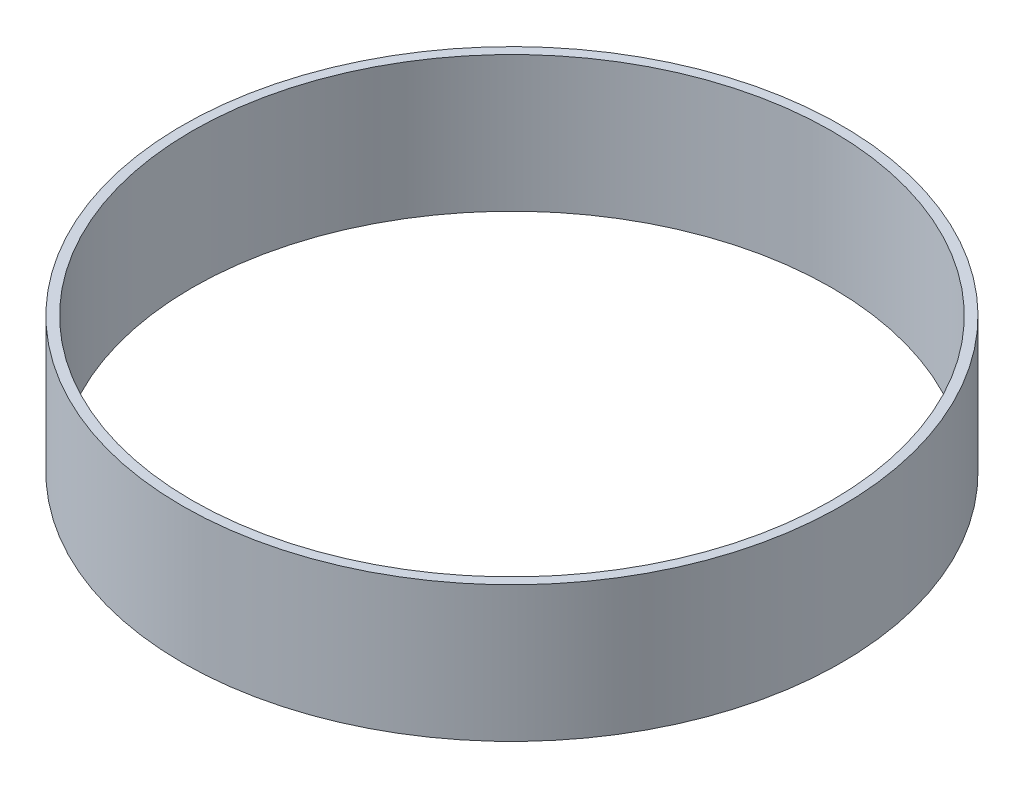
ISO-10303-21;
HEADER;
FILE_DESCRIPTION(('STEP AP214'),'2;1');
FILE_NAME('part.step','',(''),(''),'','','');
FILE_SCHEMA(('AUTOMOTIVE_DESIGN { 1 0 10303 214 1 1 1 1 }'));
ENDSEC;
DATA;
#1=APPLICATION_CONTEXT('core data for automotive mechanical design processes');
#2=APPLICATION_PROTOCOL_DEFINITION('international standard','automotive_design',2000,#1);
#3=PRODUCT_CONTEXT('',#1,'mechanical');
#4=PRODUCT('Part','Part','',(#3));
#5=PRODUCT_RELATED_PRODUCT_CATEGORY('part','',(#4));
#6=PRODUCT_DEFINITION_FORMATION('','',#4);
#7=PRODUCT_DEFINITION_CONTEXT('part definition',#1,'design');
#8=PRODUCT_DEFINITION('design','',#6,#7);
#9=PRODUCT_DEFINITION_SHAPE('','',#8);
#10=(LENGTH_UNIT() NAMED_UNIT(*) SI_UNIT(.MILLI.,.METRE.));
#11=(NAMED_UNIT(*) PLANE_ANGLE_UNIT() SI_UNIT($,.RADIAN.));
#12=(NAMED_UNIT(*) SI_UNIT($,.STERADIAN.) SOLID_ANGLE_UNIT());
#13=UNCERTAINTY_MEASURE_WITH_UNIT(LENGTH_MEASURE(1.E-05),#10,'distance_accuracy_value','');
#14=(GEOMETRIC_REPRESENTATION_CONTEXT(3) GLOBAL_UNCERTAINTY_ASSIGNED_CONTEXT((#13)) GLOBAL_UNIT_ASSIGNED_CONTEXT((#10,
#11,#12)) REPRESENTATION_CONTEXT('',''));
#15=CARTESIAN_POINT('',(0.,0.,0.));
#16=DIRECTION('',(0.,0.,1.));
#17=DIRECTION('',(1.,0.,0.));
#18=AXIS2_PLACEMENT_3D('',#15,#16,#17);
#19=CARTESIAN_POINT('',(0.,0.,0.));
#20=DIRECTION('',(0.,1.,0.));
#21=DIRECTION('',(0.,0.,1.));
#22=AXIS2_PLACEMENT_3D('',#19,#20,#21);
#23=CYLINDRICAL_SURFACE('',#22,33.);
#24=CARTESIAN_POINT('',(0.,7.,0.));
#25=DIRECTION('',(0.,1.,0.));
#26=DIRECTION('',(0.,0.,1.));
#27=AXIS2_PLACEMENT_3D('',#24,#25,#26);
#28=CIRCLE('',#27,33.);
#29=CARTESIAN_POINT('',(0.,7.,33.));
#30=VERTEX_POINT('',#29);
#31=EDGE_CURVE('E26',#30,#30,#28,.F.);
#32=ORIENTED_EDGE('',*,*,#31,.F.);
#33=EDGE_LOOP('',(#32));
#34=FACE_BOUND('',#33,.T.);
#35=CARTESIAN_POINT('',(0.,-7.,0.));
#36=DIRECTION('',(0.,1.,0.));
#37=DIRECTION('',(0.,0.,1.));
#38=AXIS2_PLACEMENT_3D('',#35,#36,#37);
#39=CIRCLE('',#38,33.);
#40=CARTESIAN_POINT('',(0.,-7.,33.));
#41=VERTEX_POINT('',#40);
#42=EDGE_CURVE('E17',#41,#41,#39,.T.);
#43=ORIENTED_EDGE('',*,*,#42,.F.);
#44=EDGE_LOOP('',(#43));
#45=FACE_BOUND('',#44,.T.);
#46=ADVANCED_FACE('F14',(#34,#45),#23,.F.);
#47=CARTESIAN_POINT('',(-34.,-7.,0.));
#48=DIRECTION('',(0.,-1.,0.));
#49=DIRECTION('',(0.,0.,-1.));
#50=AXIS2_PLACEMENT_3D('',#47,#48,#49);
#51=PLANE('',#50);
#52=CARTESIAN_POINT('',(0.,-7.,0.));
#53=DIRECTION('',(0.,1.,0.));
#54=DIRECTION('',(0.,0.,1.));
#55=AXIS2_PLACEMENT_3D('',#52,#53,#54);
#56=CIRCLE('',#55,34.);
#57=CARTESIAN_POINT('',(0.,-7.,34.));
#58=VERTEX_POINT('',#57);
#59=EDGE_CURVE('E21',#58,#58,#56,.T.);
#60=ORIENTED_EDGE('',*,*,#59,.F.);
#61=EDGE_LOOP('',(#60));
#62=FACE_BOUND('',#61,.T.);
#63=ORIENTED_EDGE('',*,*,#42,.T.);
#64=EDGE_LOOP('',(#63));
#65=FACE_BOUND('',#64,.T.);
#66=ADVANCED_FACE('F34',(#62,#65),#51,.T.);
#67=CARTESIAN_POINT('',(-33.,7.,0.));
#68=DIRECTION('',(0.,1.,0.));
#69=DIRECTION('',(0.,0.,1.));
#70=AXIS2_PLACEMENT_3D('',#67,#68,#69);
#71=PLANE('',#70);
#72=ORIENTED_EDGE('',*,*,#31,.T.);
#73=EDGE_LOOP('',(#72));
#74=FACE_BOUND('',#73,.T.);
#75=CARTESIAN_POINT('',(0.,7.,0.));
#76=DIRECTION('',(0.,1.,0.));
#77=DIRECTION('',(0.,0.,1.));
#78=AXIS2_PLACEMENT_3D('',#75,#76,#77);
#79=CIRCLE('',#78,34.);
#80=CARTESIAN_POINT('',(0.,7.,34.));
#81=VERTEX_POINT('',#80);
#82=EDGE_CURVE('E10',#81,#81,#79,.F.);
#83=ORIENTED_EDGE('',*,*,#82,.F.);
#84=EDGE_LOOP('',(#83));
#85=FACE_BOUND('',#84,.T.);
#86=ADVANCED_FACE('F42',(#74,#85),#71,.T.);
#87=CARTESIAN_POINT('',(0.,0.,0.));
#88=DIRECTION('',(0.,1.,0.));
#89=DIRECTION('',(0.,0.,1.));
#90=AXIS2_PLACEMENT_3D('',#87,#88,#89);
#91=CYLINDRICAL_SURFACE('',#90,34.);
#92=ORIENTED_EDGE('',*,*,#82,.T.);
#93=EDGE_LOOP('',(#92));
#94=FACE_BOUND('',#93,.T.);
#95=ORIENTED_EDGE('',*,*,#59,.T.);
#96=EDGE_LOOP('',(#95));
#97=FACE_BOUND('',#96,.T.);
#98=ADVANCED_FACE('F44',(#94,#97),#91,.T.);
#99=CLOSED_SHELL('',(#46,#66,#86,#98));
#100=MANIFOLD_SOLID_BREP('B1',#99);
#101=ADVANCED_BREP_SHAPE_REPRESENTATION('',(#18,#100),#14);
#102=SHAPE_DEFINITION_REPRESENTATION(#9,#101);
ENDSEC;
END-ISO-10303-21;
